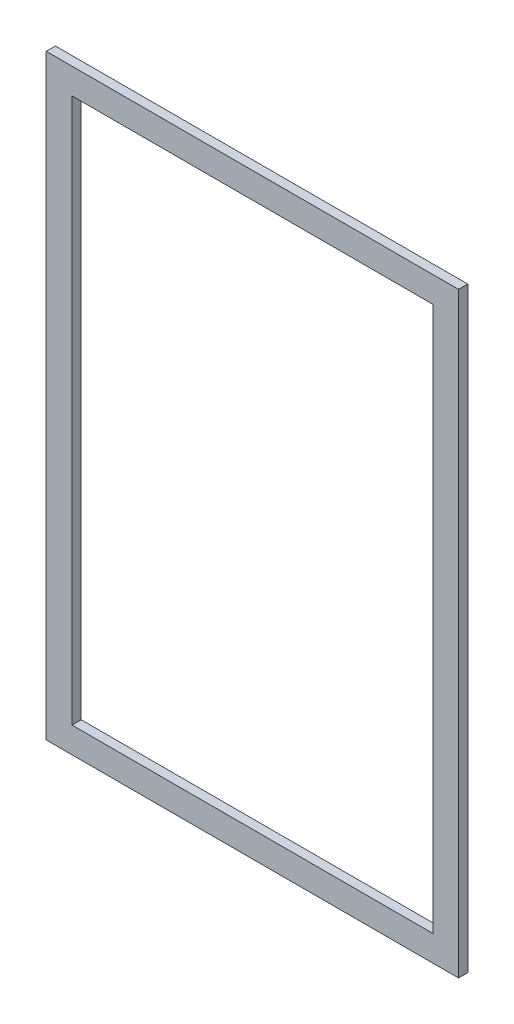
ISO-10303-21;
HEADER;
FILE_DESCRIPTION(('STEP AP214'),'2;1');
FILE_NAME('part.step','',(''),(''),'','','');
FILE_SCHEMA(('AUTOMOTIVE_DESIGN { 1 0 10303 214 1 1 1 1 }'));
ENDSEC;
DATA;
#1=APPLICATION_CONTEXT('core data for automotive mechanical design processes');
#2=APPLICATION_PROTOCOL_DEFINITION('international standard','automotive_design',2000,#1);
#3=PRODUCT_CONTEXT('',#1,'mechanical');
#4=PRODUCT('Part','Part','',(#3));
#5=PRODUCT_RELATED_PRODUCT_CATEGORY('part','',(#4));
#6=PRODUCT_DEFINITION_FORMATION('','',#4);
#7=PRODUCT_DEFINITION_CONTEXT('part definition',#1,'design');
#8=PRODUCT_DEFINITION('design','',#6,#7);
#9=PRODUCT_DEFINITION_SHAPE('','',#8);
#10=(LENGTH_UNIT() NAMED_UNIT(*) SI_UNIT(.MILLI.,.METRE.));
#11=(NAMED_UNIT(*) PLANE_ANGLE_UNIT() SI_UNIT($,.RADIAN.));
#12=(NAMED_UNIT(*) SI_UNIT($,.STERADIAN.) SOLID_ANGLE_UNIT());
#13=UNCERTAINTY_MEASURE_WITH_UNIT(LENGTH_MEASURE(1.E-05),#10,'distance_accuracy_value','');
#14=(GEOMETRIC_REPRESENTATION_CONTEXT(3) GLOBAL_UNCERTAINTY_ASSIGNED_CONTEXT((#13)) GLOBAL_UNIT_ASSIGNED_CONTEXT((#10,
#11,#12)) REPRESENTATION_CONTEXT('',''));
#15=CARTESIAN_POINT('',(0.,0.,0.));
#16=DIRECTION('',(0.,0.,1.));
#17=DIRECTION('',(1.,0.,0.));
#18=AXIS2_PLACEMENT_3D('',#15,#16,#17);
#19=CARTESIAN_POINT('',(0.,0.,5.));
#20=DIRECTION('',(0.,0.,-1.));
#21=DIRECTION('',(-1.,0.,0.));
#22=AXIS2_PLACEMENT_3D('',#19,#20,#21);
#23=PLANE('',#22);
#24=DIRECTION('',(0.,-1.,0.));
#25=VECTOR('',#24,1.);
#26=CARTESIAN_POINT('',(0.,0.,5.));
#27=LINE('',#26,#25);
#28=CARTESIAN_POINT('',(0.,324.,5.));
#29=VERTEX_POINT('',#28);
#30=CARTESIAN_POINT('',(0.,0.,5.));
#31=VERTEX_POINT('',#30);
#32=EDGE_CURVE('E139',#29,#31,#27,.T.);
#33=ORIENTED_EDGE('',*,*,#32,.T.);
#34=DIRECTION('',(1.,0.,0.));
#35=VECTOR('',#34,1.);
#36=CARTESIAN_POINT('',(0.,0.,5.));
#37=LINE('',#36,#35);
#38=CARTESIAN_POINT('',(224.,0.,5.));
#39=VERTEX_POINT('',#38);
#40=EDGE_CURVE('E142',#31,#39,#37,.T.);
#41=ORIENTED_EDGE('',*,*,#40,.T.);
#42=DIRECTION('',(0.,1.,0.));
#43=VECTOR('',#42,1.);
#44=CARTESIAN_POINT('',(224.,0.,5.));
#45=LINE('',#44,#43);
#46=CARTESIAN_POINT('',(224.,324.,5.));
#47=VERTEX_POINT('',#46);
#48=EDGE_CURVE('E147',#39,#47,#45,.T.);
#49=ORIENTED_EDGE('',*,*,#48,.T.);
#50=DIRECTION('',(-1.,0.,0.));
#51=VECTOR('',#50,1.);
#52=CARTESIAN_POINT('',(0.,324.,5.));
#53=LINE('',#52,#51);
#54=EDGE_CURVE('E149',#47,#29,#53,.T.);
#55=ORIENTED_EDGE('',*,*,#54,.T.);
#56=EDGE_LOOP('',(#33,#41,#49,#55));
#57=FACE_BOUND('',#56,.T.);
#58=DIRECTION('',(0.,-1.,0.));
#59=VECTOR('',#58,1.);
#60=CARTESIAN_POINT('',(14.,14.,5.));
#61=LINE('',#60,#59);
#62=CARTESIAN_POINT('',(14.,310.,5.));
#63=VERTEX_POINT('',#62);
#64=CARTESIAN_POINT('',(14.,14.,5.));
#65=VERTEX_POINT('',#64);
#66=EDGE_CURVE('E101',#63,#65,#61,.T.);
#67=ORIENTED_EDGE('',*,*,#66,.F.);
#68=DIRECTION('',(-1.,0.,0.));
#69=VECTOR('',#68,1.);
#70=CARTESIAN_POINT('',(14.,310.,5.));
#71=LINE('',#70,#69);
#72=CARTESIAN_POINT('',(210.,310.,5.));
#73=VERTEX_POINT('',#72);
#74=EDGE_CURVE('E128',#73,#63,#71,.T.);
#75=ORIENTED_EDGE('',*,*,#74,.F.);
#76=DIRECTION('',(0.,1.,0.));
#77=VECTOR('',#76,1.);
#78=CARTESIAN_POINT('',(210.,14.,5.));
#79=LINE('',#78,#77);
#80=CARTESIAN_POINT('',(210.,14.,5.));
#81=VERTEX_POINT('',#80);
#82=EDGE_CURVE('E125',#81,#73,#79,.T.);
#83=ORIENTED_EDGE('',*,*,#82,.F.);
#84=DIRECTION('',(1.,0.,0.));
#85=VECTOR('',#84,1.);
#86=CARTESIAN_POINT('',(14.,14.,5.));
#87=LINE('',#86,#85);
#88=EDGE_CURVE('E115',#65,#81,#87,.T.);
#89=ORIENTED_EDGE('',*,*,#88,.F.);
#90=EDGE_LOOP('',(#67,#75,#83,#89));
#91=FACE_BOUND('',#90,.T.);
#92=ADVANCED_FACE('F39',(#57,#91),#23,.F.);
#93=CARTESIAN_POINT('',(0.,0.,0.));
#94=DIRECTION('',(0.,0.,-1.));
#95=DIRECTION('',(-1.,0.,0.));
#96=AXIS2_PLACEMENT_3D('',#93,#94,#95);
#97=PLANE('',#96);
#98=DIRECTION('',(0.,-1.,0.));
#99=VECTOR('',#98,1.);
#100=CARTESIAN_POINT('',(0.,0.,0.));
#101=LINE('',#100,#99);
#102=CARTESIAN_POINT('',(0.,324.,0.));
#103=VERTEX_POINT('',#102);
#104=CARTESIAN_POINT('',(0.,0.,0.));
#105=VERTEX_POINT('',#104);
#106=EDGE_CURVE('E120',#103,#105,#101,.T.);
#107=ORIENTED_EDGE('',*,*,#106,.F.);
#108=DIRECTION('',(-1.,0.,0.));
#109=VECTOR('',#108,1.);
#110=CARTESIAN_POINT('',(0.,324.,0.));
#111=LINE('',#110,#109);
#112=CARTESIAN_POINT('',(224.,324.,0.));
#113=VERTEX_POINT('',#112);
#114=EDGE_CURVE('E143',#113,#103,#111,.T.);
#115=ORIENTED_EDGE('',*,*,#114,.F.);
#116=DIRECTION('',(0.,1.,0.));
#117=VECTOR('',#116,1.);
#118=CARTESIAN_POINT('',(224.,0.,0.));
#119=LINE('',#118,#117);
#120=CARTESIAN_POINT('',(224.,0.,0.));
#121=VERTEX_POINT('',#120);
#122=EDGE_CURVE('E155',#121,#113,#119,.T.);
#123=ORIENTED_EDGE('',*,*,#122,.F.);
#124=DIRECTION('',(1.,0.,0.));
#125=VECTOR('',#124,1.);
#126=CARTESIAN_POINT('',(0.,0.,0.));
#127=LINE('',#126,#125);
#128=EDGE_CURVE('E154',#105,#121,#127,.T.);
#129=ORIENTED_EDGE('',*,*,#128,.F.);
#130=EDGE_LOOP('',(#107,#115,#123,#129));
#131=FACE_BOUND('',#130,.T.);
#132=DIRECTION('',(-1.,0.,0.));
#133=VECTOR('',#132,1.);
#134=CARTESIAN_POINT('',(14.,310.,0.));
#135=LINE('',#134,#133);
#136=CARTESIAN_POINT('',(210.,310.,0.));
#137=VERTEX_POINT('',#136);
#138=CARTESIAN_POINT('',(14.,310.,0.));
#139=VERTEX_POINT('',#138);
#140=EDGE_CURVE('E111',#137,#139,#135,.T.);
#141=ORIENTED_EDGE('',*,*,#140,.T.);
#142=DIRECTION('',(0.,-1.,0.));
#143=VECTOR('',#142,1.);
#144=CARTESIAN_POINT('',(14.,14.,0.));
#145=LINE('',#144,#143);
#146=CARTESIAN_POINT('',(14.,14.,0.));
#147=VERTEX_POINT('',#146);
#148=EDGE_CURVE('E62',#139,#147,#145,.T.);
#149=ORIENTED_EDGE('',*,*,#148,.T.);
#150=DIRECTION('',(1.,0.,0.));
#151=VECTOR('',#150,1.);
#152=CARTESIAN_POINT('',(14.,14.,0.));
#153=LINE('',#152,#151);
#154=CARTESIAN_POINT('',(210.,14.,0.));
#155=VERTEX_POINT('',#154);
#156=EDGE_CURVE('E118',#147,#155,#153,.T.);
#157=ORIENTED_EDGE('',*,*,#156,.T.);
#158=DIRECTION('',(0.,1.,0.));
#159=VECTOR('',#158,1.);
#160=CARTESIAN_POINT('',(210.,14.,0.));
#161=LINE('',#160,#159);
#162=EDGE_CURVE('E135',#155,#137,#161,.T.);
#163=ORIENTED_EDGE('',*,*,#162,.T.);
#164=EDGE_LOOP('',(#141,#149,#157,#163));
#165=FACE_BOUND('',#164,.T.);
#166=ADVANCED_FACE('F171',(#131,#165),#97,.T.);
#167=CARTESIAN_POINT('',(0.,0.,5.));
#168=DIRECTION('',(1.,0.,0.));
#169=DIRECTION('',(0.,0.,-1.));
#170=AXIS2_PLACEMENT_3D('',#167,#168,#169);
#171=PLANE('',#170);
#172=ORIENTED_EDGE('',*,*,#106,.T.);
#173=DIRECTION('',(0.,0.,-1.));
#174=VECTOR('',#173,1.);
#175=CARTESIAN_POINT('',(0.,0.,5.));
#176=LINE('',#175,#174);
#177=EDGE_CURVE('E11',#31,#105,#176,.T.);
#178=ORIENTED_EDGE('',*,*,#177,.F.);
#179=ORIENTED_EDGE('',*,*,#32,.F.);
#180=DIRECTION('',(0.,0.,-1.));
#181=VECTOR('',#180,1.);
#182=CARTESIAN_POINT('',(0.,324.,5.));
#183=LINE('',#182,#181);
#184=EDGE_CURVE('E148',#29,#103,#183,.T.);
#185=ORIENTED_EDGE('',*,*,#184,.T.);
#186=EDGE_LOOP('',(#172,#178,#179,#185));
#187=FACE_BOUND('',#186,.T.);
#188=ADVANCED_FACE('F41',(#187),#171,.F.);
#189=CARTESIAN_POINT('',(0.,0.,5.));
#190=DIRECTION('',(0.,1.,0.));
#191=DIRECTION('',(0.,0.,1.));
#192=AXIS2_PLACEMENT_3D('',#189,#190,#191);
#193=PLANE('',#192);
#194=ORIENTED_EDGE('',*,*,#128,.T.);
#195=DIRECTION('',(0.,0.,-1.));
#196=VECTOR('',#195,1.);
#197=CARTESIAN_POINT('',(224.,0.,5.));
#198=LINE('',#197,#196);
#199=EDGE_CURVE('E50',#39,#121,#198,.T.);
#200=ORIENTED_EDGE('',*,*,#199,.F.);
#201=ORIENTED_EDGE('',*,*,#40,.F.);
#202=ORIENTED_EDGE('',*,*,#177,.T.);
#203=EDGE_LOOP('',(#194,#200,#201,#202));
#204=FACE_BOUND('',#203,.T.);
#205=ADVANCED_FACE('F183',(#204),#193,.F.);
#206=CARTESIAN_POINT('',(224.,0.,5.));
#207=DIRECTION('',(-1.,0.,0.));
#208=DIRECTION('',(0.,0.,1.));
#209=AXIS2_PLACEMENT_3D('',#206,#207,#208);
#210=PLANE('',#209);
#211=ORIENTED_EDGE('',*,*,#122,.T.);
#212=DIRECTION('',(0.,0.,-1.));
#213=VECTOR('',#212,1.);
#214=CARTESIAN_POINT('',(224.,324.,5.));
#215=LINE('',#214,#213);
#216=EDGE_CURVE('E158',#47,#113,#215,.T.);
#217=ORIENTED_EDGE('',*,*,#216,.F.);
#218=ORIENTED_EDGE('',*,*,#48,.F.);
#219=ORIENTED_EDGE('',*,*,#199,.T.);
#220=EDGE_LOOP('',(#211,#217,#218,#219));
#221=FACE_BOUND('',#220,.T.);
#222=ADVANCED_FACE('F167',(#221),#210,.F.);
#223=CARTESIAN_POINT('',(0.,324.,5.));
#224=DIRECTION('',(0.,-1.,0.));
#225=DIRECTION('',(0.,0.,-1.));
#226=AXIS2_PLACEMENT_3D('',#223,#224,#225);
#227=PLANE('',#226);
#228=ORIENTED_EDGE('',*,*,#114,.T.);
#229=ORIENTED_EDGE('',*,*,#184,.F.);
#230=ORIENTED_EDGE('',*,*,#54,.F.);
#231=ORIENTED_EDGE('',*,*,#216,.T.);
#232=EDGE_LOOP('',(#228,#229,#230,#231));
#233=FACE_BOUND('',#232,.T.);
#234=ADVANCED_FACE('F180',(#233),#227,.F.);
#235=CARTESIAN_POINT('',(14.,14.,5.));
#236=DIRECTION('',(1.,0.,0.));
#237=DIRECTION('',(0.,0.,-1.));
#238=AXIS2_PLACEMENT_3D('',#235,#236,#237);
#239=PLANE('',#238);
#240=ORIENTED_EDGE('',*,*,#148,.F.);
#241=DIRECTION('',(0.,0.,-1.));
#242=VECTOR('',#241,1.);
#243=CARTESIAN_POINT('',(14.,310.,5.));
#244=LINE('',#243,#242);
#245=EDGE_CURVE('E109',#63,#139,#244,.T.);
#246=ORIENTED_EDGE('',*,*,#245,.F.);
#247=ORIENTED_EDGE('',*,*,#66,.T.);
#248=DIRECTION('',(0.,0.,-1.));
#249=VECTOR('',#248,1.);
#250=CARTESIAN_POINT('',(14.,14.,5.));
#251=LINE('',#250,#249);
#252=EDGE_CURVE('E107',#65,#147,#251,.T.);
#253=ORIENTED_EDGE('',*,*,#252,.T.);
#254=EDGE_LOOP('',(#240,#246,#247,#253));
#255=FACE_BOUND('',#254,.T.);
#256=ADVANCED_FACE('F106',(#255),#239,.T.);
#257=CARTESIAN_POINT('',(14.,14.,5.));
#258=DIRECTION('',(0.,1.,0.));
#259=DIRECTION('',(0.,0.,1.));
#260=AXIS2_PLACEMENT_3D('',#257,#258,#259);
#261=PLANE('',#260);
#262=ORIENTED_EDGE('',*,*,#156,.F.);
#263=ORIENTED_EDGE('',*,*,#252,.F.);
#264=ORIENTED_EDGE('',*,*,#88,.T.);
#265=DIRECTION('',(0.,0.,-1.));
#266=VECTOR('',#265,1.);
#267=CARTESIAN_POINT('',(210.,14.,5.));
#268=LINE('',#267,#266);
#269=EDGE_CURVE('E123',#81,#155,#268,.T.);
#270=ORIENTED_EDGE('',*,*,#269,.T.);
#271=EDGE_LOOP('',(#262,#263,#264,#270));
#272=FACE_BOUND('',#271,.T.);
#273=ADVANCED_FACE('F116',(#272),#261,.T.);
#274=CARTESIAN_POINT('',(210.,14.,5.));
#275=DIRECTION('',(-1.,0.,0.));
#276=DIRECTION('',(0.,0.,1.));
#277=AXIS2_PLACEMENT_3D('',#274,#275,#276);
#278=PLANE('',#277);
#279=ORIENTED_EDGE('',*,*,#162,.F.);
#280=ORIENTED_EDGE('',*,*,#269,.F.);
#281=ORIENTED_EDGE('',*,*,#82,.T.);
#282=DIRECTION('',(0.,0.,-1.));
#283=VECTOR('',#282,1.);
#284=CARTESIAN_POINT('',(210.,310.,5.));
#285=LINE('',#284,#283);
#286=EDGE_CURVE('E53',#73,#137,#285,.T.);
#287=ORIENTED_EDGE('',*,*,#286,.T.);
#288=EDGE_LOOP('',(#279,#280,#281,#287));
#289=FACE_BOUND('',#288,.T.);
#290=ADVANCED_FACE('F206',(#289),#278,.T.);
#291=CARTESIAN_POINT('',(14.,310.,5.));
#292=DIRECTION('',(0.,-1.,0.));
#293=DIRECTION('',(0.,0.,-1.));
#294=AXIS2_PLACEMENT_3D('',#291,#292,#293);
#295=PLANE('',#294);
#296=ORIENTED_EDGE('',*,*,#140,.F.);
#297=ORIENTED_EDGE('',*,*,#286,.F.);
#298=ORIENTED_EDGE('',*,*,#74,.T.);
#299=ORIENTED_EDGE('',*,*,#245,.T.);
#300=EDGE_LOOP('',(#296,#297,#298,#299));
#301=FACE_BOUND('',#300,.T.);
#302=ADVANCED_FACE('F210',(#301),#295,.T.);
#303=CLOSED_SHELL('',(#92,#166,#188,#205,#222,#234,#256,#273,#290,#302));
#304=MANIFOLD_SOLID_BREP('B2',#303);
#305=ADVANCED_BREP_SHAPE_REPRESENTATION('',(#18,#304),#14);
#306=SHAPE_DEFINITION_REPRESENTATION(#9,#305);
ENDSEC;
END-ISO-10303-21;
